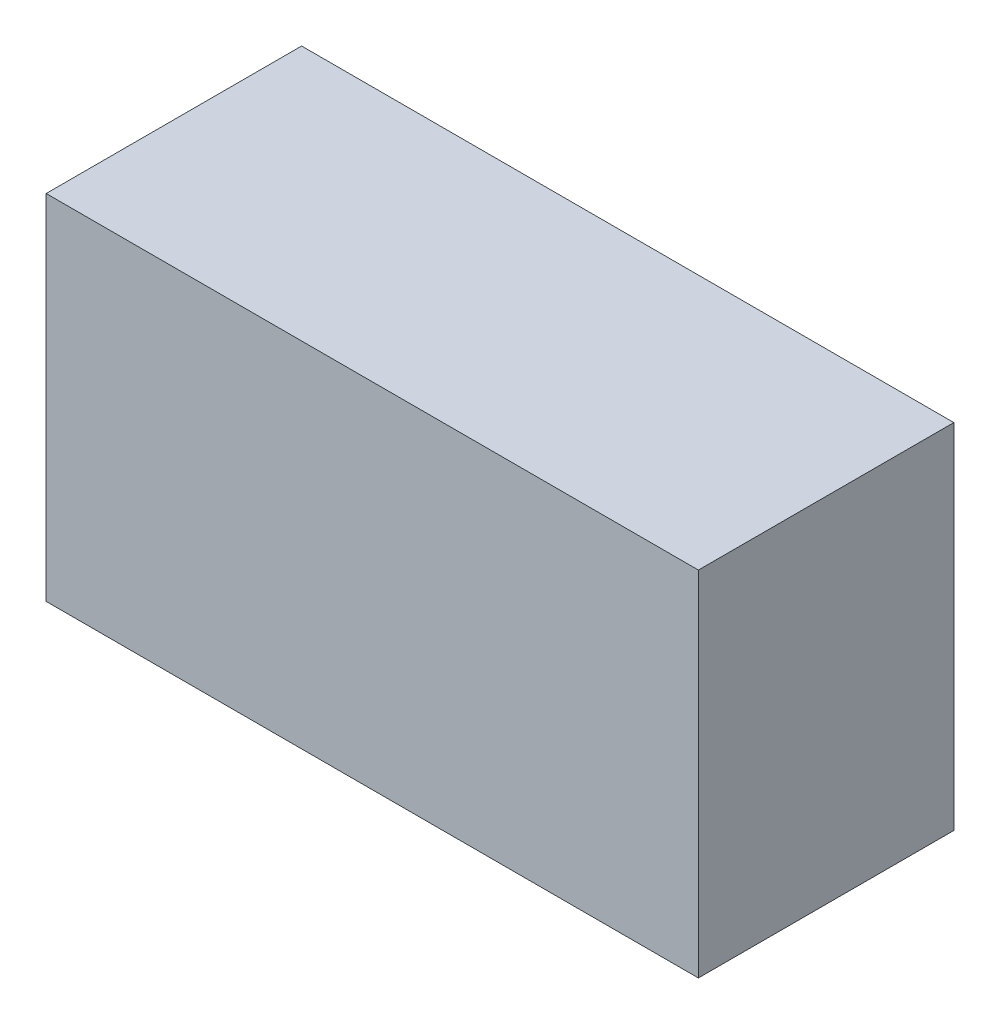
ISO-10303-21;
HEADER;
FILE_DESCRIPTION(('STEP AP214'),'2;1');
FILE_NAME('part.step','',(''),(''),'','','');
FILE_SCHEMA(('AUTOMOTIVE_DESIGN { 1 0 10303 214 1 1 1 1 }'));
ENDSEC;
DATA;
#1=APPLICATION_CONTEXT('core data for automotive mechanical design processes');
#2=APPLICATION_PROTOCOL_DEFINITION('international standard','automotive_design',2000,#1);
#3=PRODUCT_CONTEXT('',#1,'mechanical');
#4=PRODUCT('Part','Part','',(#3));
#5=PRODUCT_RELATED_PRODUCT_CATEGORY('part','',(#4));
#6=PRODUCT_DEFINITION_FORMATION('','',#4);
#7=PRODUCT_DEFINITION_CONTEXT('part definition',#1,'design');
#8=PRODUCT_DEFINITION('design','',#6,#7);
#9=PRODUCT_DEFINITION_SHAPE('','',#8);
#10=(LENGTH_UNIT() NAMED_UNIT(*) SI_UNIT(.MILLI.,.METRE.));
#11=(NAMED_UNIT(*) PLANE_ANGLE_UNIT() SI_UNIT($,.RADIAN.));
#12=(NAMED_UNIT(*) SI_UNIT($,.STERADIAN.) SOLID_ANGLE_UNIT());
#13=UNCERTAINTY_MEASURE_WITH_UNIT(LENGTH_MEASURE(1.E-05),#10,'distance_accuracy_value','');
#14=(GEOMETRIC_REPRESENTATION_CONTEXT(3) GLOBAL_UNCERTAINTY_ASSIGNED_CONTEXT((#13)) GLOBAL_UNIT_ASSIGNED_CONTEXT((#10,
#11,#12)) REPRESENTATION_CONTEXT('',''));
#15=CARTESIAN_POINT('',(0.,0.,0.));
#16=DIRECTION('',(0.,0.,1.));
#17=DIRECTION('',(1.,0.,0.));
#18=AXIS2_PLACEMENT_3D('',#15,#16,#17);
#19=CARTESIAN_POINT('',(0.,0.,23.5));
#20=DIRECTION('',(1.,0.,0.));
#21=DIRECTION('',(0.,0.,-1.));
#22=AXIS2_PLACEMENT_3D('',#19,#20,#21);
#23=PLANE('',#22);
#24=DIRECTION('',(0.,-1.,0.));
#25=VECTOR('',#24,1.);
#26=CARTESIAN_POINT('',(0.,0.,0.));
#27=LINE('',#26,#25);
#28=CARTESIAN_POINT('',(0.,32.5,0.));
#29=VERTEX_POINT('',#28);
#30=CARTESIAN_POINT('',(0.,0.,0.));
#31=VERTEX_POINT('',#30);
#32=EDGE_CURVE('E96',#29,#31,#27,.T.);
#33=ORIENTED_EDGE('',*,*,#32,.T.);
#34=DIRECTION('',(0.,0.,-1.));
#35=VECTOR('',#34,1.);
#36=CARTESIAN_POINT('',(0.,0.,23.5));
#37=LINE('',#36,#35);
#38=CARTESIAN_POINT('',(0.,0.,23.5));
#39=VERTEX_POINT('',#38);
#40=EDGE_CURVE('E11',#39,#31,#37,.T.);
#41=ORIENTED_EDGE('',*,*,#40,.F.);
#42=DIRECTION('',(0.,-1.,0.));
#43=VECTOR('',#42,1.);
#44=CARTESIAN_POINT('',(0.,0.,23.5));
#45=LINE('',#44,#43);
#46=CARTESIAN_POINT('',(0.,32.5,23.5));
#47=VERTEX_POINT('',#46);
#48=EDGE_CURVE('E84',#47,#39,#45,.T.);
#49=ORIENTED_EDGE('',*,*,#48,.F.);
#50=DIRECTION('',(0.,0.,-1.));
#51=VECTOR('',#50,1.);
#52=CARTESIAN_POINT('',(0.,32.5,23.5));
#53=LINE('',#52,#51);
#54=EDGE_CURVE('E92',#47,#29,#53,.T.);
#55=ORIENTED_EDGE('',*,*,#54,.T.);
#56=EDGE_LOOP('',(#33,#41,#49,#55));
#57=FACE_BOUND('',#56,.T.);
#58=ADVANCED_FACE('F33',(#57),#23,.F.);
#59=CARTESIAN_POINT('',(0.,0.,23.5));
#60=DIRECTION('',(0.,1.,0.));
#61=DIRECTION('',(0.,0.,1.));
#62=AXIS2_PLACEMENT_3D('',#59,#60,#61);
#63=PLANE('',#62);
#64=DIRECTION('',(1.,0.,0.));
#65=VECTOR('',#64,1.);
#66=CARTESIAN_POINT('',(0.,0.,0.));
#67=LINE('',#66,#65);
#68=CARTESIAN_POINT('',(60.,0.,0.));
#69=VERTEX_POINT('',#68);
#70=EDGE_CURVE('E88',#31,#69,#67,.T.);
#71=ORIENTED_EDGE('',*,*,#70,.T.);
#72=DIRECTION('',(0.,0.,-1.));
#73=VECTOR('',#72,1.);
#74=CARTESIAN_POINT('',(60.,0.,23.5));
#75=LINE('',#74,#73);
#76=CARTESIAN_POINT('',(60.,0.,23.5));
#77=VERTEX_POINT('',#76);
#78=EDGE_CURVE('E41',#77,#69,#75,.T.);
#79=ORIENTED_EDGE('',*,*,#78,.F.);
#80=DIRECTION('',(1.,0.,0.));
#81=VECTOR('',#80,1.);
#82=CARTESIAN_POINT('',(0.,0.,23.5));
#83=LINE('',#82,#81);
#84=EDGE_CURVE('E79',#39,#77,#83,.T.);
#85=ORIENTED_EDGE('',*,*,#84,.F.);
#86=ORIENTED_EDGE('',*,*,#40,.T.);
#87=EDGE_LOOP('',(#71,#79,#85,#86));
#88=FACE_BOUND('',#87,.T.);
#89=ADVANCED_FACE('F87',(#88),#63,.F.);
#90=CARTESIAN_POINT('',(60.,0.,23.5));
#91=DIRECTION('',(-1.,0.,0.));
#92=DIRECTION('',(0.,0.,1.));
#93=AXIS2_PLACEMENT_3D('',#90,#91,#92);
#94=PLANE('',#93);
#95=DIRECTION('',(0.,1.,0.));
#96=VECTOR('',#95,1.);
#97=CARTESIAN_POINT('',(60.,0.,0.));
#98=LINE('',#97,#96);
#99=CARTESIAN_POINT('',(60.,32.5,0.));
#100=VERTEX_POINT('',#99);
#101=EDGE_CURVE('E66',#69,#100,#98,.T.);
#102=ORIENTED_EDGE('',*,*,#101,.T.);
#103=DIRECTION('',(0.,0.,-1.));
#104=VECTOR('',#103,1.);
#105=CARTESIAN_POINT('',(60.,32.5,23.5));
#106=LINE('',#105,#104);
#107=CARTESIAN_POINT('',(60.,32.5,23.5));
#108=VERTEX_POINT('',#107);
#109=EDGE_CURVE('E89',#108,#100,#106,.T.);
#110=ORIENTED_EDGE('',*,*,#109,.F.);
#111=DIRECTION('',(0.,1.,0.));
#112=VECTOR('',#111,1.);
#113=CARTESIAN_POINT('',(60.,0.,23.5));
#114=LINE('',#113,#112);
#115=EDGE_CURVE('E82',#77,#108,#114,.T.);
#116=ORIENTED_EDGE('',*,*,#115,.F.);
#117=ORIENTED_EDGE('',*,*,#78,.T.);
#118=EDGE_LOOP('',(#102,#110,#116,#117));
#119=FACE_BOUND('',#118,.T.);
#120=ADVANCED_FACE('F90',(#119),#94,.F.);
#121=CARTESIAN_POINT('',(0.,32.5,23.5));
#122=DIRECTION('',(0.,-1.,0.));
#123=DIRECTION('',(0.,0.,-1.));
#124=AXIS2_PLACEMENT_3D('',#121,#122,#123);
#125=PLANE('',#124);
#126=DIRECTION('',(-1.,0.,0.));
#127=VECTOR('',#126,1.);
#128=CARTESIAN_POINT('',(0.,32.5,0.));
#129=LINE('',#128,#127);
#130=EDGE_CURVE('E72',#100,#29,#129,.T.);
#131=ORIENTED_EDGE('',*,*,#130,.T.);
#132=ORIENTED_EDGE('',*,*,#54,.F.);
#133=DIRECTION('',(-1.,0.,0.));
#134=VECTOR('',#133,1.);
#135=CARTESIAN_POINT('',(0.,32.5,23.5));
#136=LINE('',#135,#134);
#137=EDGE_CURVE('E49',#108,#47,#136,.T.);
#138=ORIENTED_EDGE('',*,*,#137,.F.);
#139=ORIENTED_EDGE('',*,*,#109,.T.);
#140=EDGE_LOOP('',(#131,#132,#138,#139));
#141=FACE_BOUND('',#140,.T.);
#142=ADVANCED_FACE('F103',(#141),#125,.F.);
#143=CARTESIAN_POINT('',(0.,0.,23.5));
#144=DIRECTION('',(0.,0.,-1.));
#145=DIRECTION('',(-1.,0.,0.));
#146=AXIS2_PLACEMENT_3D('',#143,#144,#145);
#147=PLANE('',#146);
#148=ORIENTED_EDGE('',*,*,#48,.T.);
#149=ORIENTED_EDGE('',*,*,#84,.T.);
#150=ORIENTED_EDGE('',*,*,#115,.T.);
#151=ORIENTED_EDGE('',*,*,#137,.T.);
#152=EDGE_LOOP('',(#148,#149,#150,#151));
#153=FACE_BOUND('',#152,.T.);
#154=ADVANCED_FACE('F80',(#153),#147,.F.);
#155=CARTESIAN_POINT('',(0.,0.,0.));
#156=DIRECTION('',(0.,0.,-1.));
#157=DIRECTION('',(-1.,0.,0.));
#158=AXIS2_PLACEMENT_3D('',#155,#156,#157);
#159=PLANE('',#158);
#160=ORIENTED_EDGE('',*,*,#32,.F.);
#161=ORIENTED_EDGE('',*,*,#130,.F.);
#162=ORIENTED_EDGE('',*,*,#101,.F.);
#163=ORIENTED_EDGE('',*,*,#70,.F.);
#164=EDGE_LOOP('',(#160,#161,#162,#163));
#165=FACE_BOUND('',#164,.T.);
#166=ADVANCED_FACE('F106',(#165),#159,.T.);
#167=CLOSED_SHELL('',(#58,#89,#120,#142,#154,#166));
#168=MANIFOLD_SOLID_BREP('B2',#167);
#169=ADVANCED_BREP_SHAPE_REPRESENTATION('',(#18,#168),#14);
#170=SHAPE_DEFINITION_REPRESENTATION(#9,#169);
ENDSEC;
END-ISO-10303-21;
